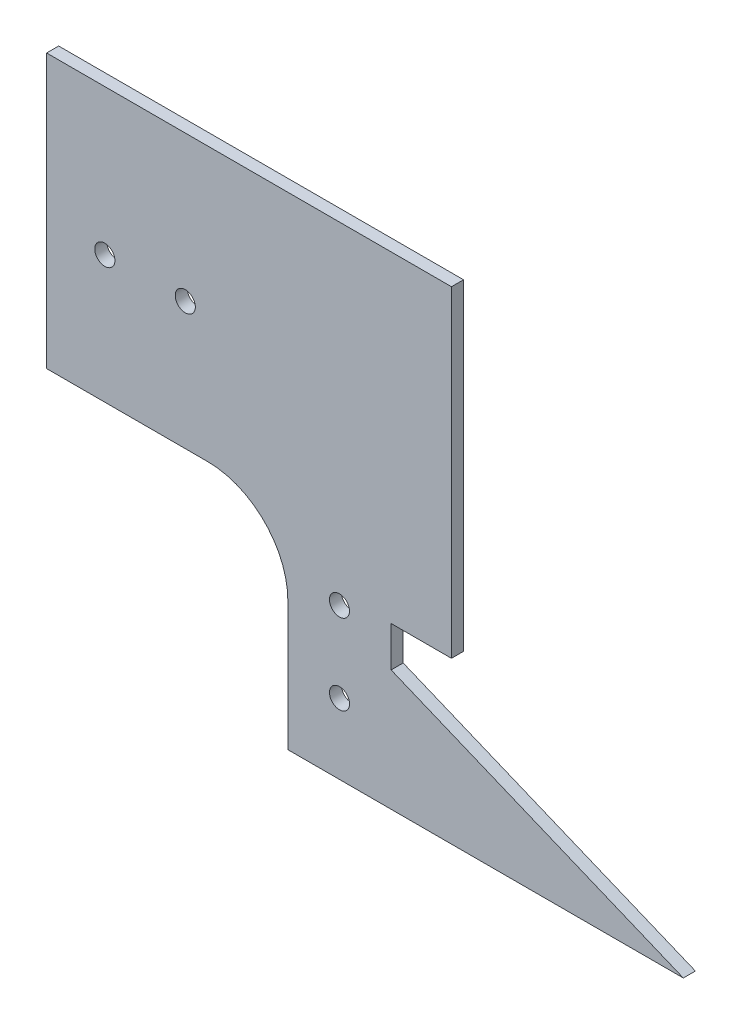
ISO-10303-21;
HEADER;
FILE_DESCRIPTION(('STEP AP214'),'2;1');
FILE_NAME('part.step','',(''),(''),'','','');
FILE_SCHEMA(('AUTOMOTIVE_DESIGN { 1 0 10303 214 1 1 1 1 }'));
ENDSEC;
DATA;
#1=APPLICATION_CONTEXT('core data for automotive mechanical design processes');
#2=APPLICATION_PROTOCOL_DEFINITION('international standard','automotive_design',2000,#1);
#3=PRODUCT_CONTEXT('',#1,'mechanical');
#4=PRODUCT('Part','Part','',(#3));
#5=PRODUCT_RELATED_PRODUCT_CATEGORY('part','',(#4));
#6=PRODUCT_DEFINITION_FORMATION('','',#4);
#7=PRODUCT_DEFINITION_CONTEXT('part definition',#1,'design');
#8=PRODUCT_DEFINITION('design','',#6,#7);
#9=PRODUCT_DEFINITION_SHAPE('','',#8);
#10=(LENGTH_UNIT() NAMED_UNIT(*) SI_UNIT(.MILLI.,.METRE.));
#11=(NAMED_UNIT(*) PLANE_ANGLE_UNIT() SI_UNIT($,.RADIAN.));
#12=(NAMED_UNIT(*) SI_UNIT($,.STERADIAN.) SOLID_ANGLE_UNIT());
#13=UNCERTAINTY_MEASURE_WITH_UNIT(LENGTH_MEASURE(1.E-05),#10,'distance_accuracy_value','');
#14=(GEOMETRIC_REPRESENTATION_CONTEXT(3) GLOBAL_UNCERTAINTY_ASSIGNED_CONTEXT((#13)) GLOBAL_UNIT_ASSIGNED_CONTEXT((#10,
#11,#12)) REPRESENTATION_CONTEXT('',''));
#15=CARTESIAN_POINT('',(0.,0.,0.));
#16=DIRECTION('',(0.,0.,1.));
#17=DIRECTION('',(1.,0.,0.));
#18=AXIS2_PLACEMENT_3D('',#15,#16,#17);
#19=CARTESIAN_POINT('',(40.0245996330395,32.076104431391,3.));
#20=DIRECTION('',(0.,0.,-1.));
#21=DIRECTION('',(-1.,0.,0.));
#22=AXIS2_PLACEMENT_3D('',#19,#20,#21);
#23=CYLINDRICAL_SURFACE('',#22,19.9754003669605);
#24=CARTESIAN_POINT('',(40.0245996330395,32.076104431391,0.));
#25=DIRECTION('',(0.,0.,1.));
#26=DIRECTION('',(1.,0.,0.));
#27=AXIS2_PLACEMENT_3D('',#24,#25,#26);
#28=CIRCLE('',#27,19.9754003669605);
#29=CARTESIAN_POINT('',(60.,32.076104431391,0.));
#30=VERTEX_POINT('',#29);
#31=CARTESIAN_POINT('',(40.0245996330395,52.0515047983515,0.));
#32=VERTEX_POINT('',#31);
#33=EDGE_CURVE('E170',#30,#32,#28,.T.);
#34=ORIENTED_EDGE('',*,*,#33,.F.);
#35=DIRECTION('',(0.,0.,-1.));
#36=VECTOR('',#35,1.);
#37=CARTESIAN_POINT('',(60.,32.076104431391,3.));
#38=LINE('',#37,#36);
#39=CARTESIAN_POINT('',(60.,32.076104431391,3.));
#40=VERTEX_POINT('',#39);
#41=EDGE_CURVE('E11',#40,#30,#38,.T.);
#42=ORIENTED_EDGE('',*,*,#41,.F.);
#43=CARTESIAN_POINT('',(40.0245996330395,32.076104431391,3.));
#44=DIRECTION('',(0.,0.,1.));
#45=DIRECTION('',(1.,0.,0.));
#46=AXIS2_PLACEMENT_3D('',#43,#44,#45);
#47=CIRCLE('',#46,19.9754003669605);
#48=CARTESIAN_POINT('',(40.0245996330395,52.0515047983515,3.));
#49=VERTEX_POINT('',#48);
#50=EDGE_CURVE('E421',#40,#49,#47,.T.);
#51=ORIENTED_EDGE('',*,*,#50,.T.);
#52=DIRECTION('',(0.,0.,-1.));
#53=VECTOR('',#52,1.);
#54=CARTESIAN_POINT('',(40.0245996330395,52.0515047983515,3.));
#55=LINE('',#54,#53);
#56=EDGE_CURVE('E56',#49,#32,#55,.T.);
#57=ORIENTED_EDGE('',*,*,#56,.T.);
#58=EDGE_LOOP('',(#34,#42,#51,#57));
#59=FACE_BOUND('',#58,.T.);
#60=ADVANCED_FACE('F39',(#59),#23,.F.);
#61=CARTESIAN_POINT('',(60.,0.,3.));
#62=DIRECTION('',(-1.,0.,0.));
#63=DIRECTION('',(0.,-1.,0.));
#64=AXIS2_PLACEMENT_3D('',#61,#62,#63);
#65=PLANE('',#64);
#66=DIRECTION('',(0.,1.,0.));
#67=VECTOR('',#66,1.);
#68=CARTESIAN_POINT('',(60.,0.,0.));
#69=LINE('',#68,#67);
#70=CARTESIAN_POINT('',(60.,0.,0.));
#71=VERTEX_POINT('',#70);
#72=EDGE_CURVE('E167',#71,#30,#69,.T.);
#73=ORIENTED_EDGE('',*,*,#72,.F.);
#74=DIRECTION('',(0.,0.,-1.));
#75=VECTOR('',#74,1.);
#76=CARTESIAN_POINT('',(60.,0.,3.));
#77=LINE('',#76,#75);
#78=CARTESIAN_POINT('',(60.,0.,3.));
#79=VERTEX_POINT('',#78);
#80=EDGE_CURVE('E48',#79,#71,#77,.T.);
#81=ORIENTED_EDGE('',*,*,#80,.F.);
#82=DIRECTION('',(0.,1.,0.));
#83=VECTOR('',#82,1.);
#84=CARTESIAN_POINT('',(60.,0.,3.));
#85=LINE('',#84,#83);
#86=EDGE_CURVE('E419',#79,#40,#85,.T.);
#87=ORIENTED_EDGE('',*,*,#86,.T.);
#88=ORIENTED_EDGE('',*,*,#41,.T.);
#89=EDGE_LOOP('',(#73,#81,#87,#88));
#90=FACE_BOUND('',#89,.T.);
#91=ADVANCED_FACE('F168',(#90),#65,.T.);
#92=CARTESIAN_POINT('',(0.,0.,3.));
#93=DIRECTION('',(0.,-1.,0.));
#94=DIRECTION('',(1.,0.,0.));
#95=AXIS2_PLACEMENT_3D('',#92,#93,#94);
#96=PLANE('',#95);
#97=DIRECTION('',(-1.,0.,0.));
#98=VECTOR('',#97,1.);
#99=CARTESIAN_POINT('',(0.,0.,0.));
#100=LINE('',#99,#98);
#101=CARTESIAN_POINT('',(158.303291844802,0.,0.));
#102=VERTEX_POINT('',#101);
#103=EDGE_CURVE('E159',#102,#71,#100,.T.);
#104=ORIENTED_EDGE('',*,*,#103,.F.);
#105=DIRECTION('',(0.,0.,-1.));
#106=VECTOR('',#105,1.);
#107=CARTESIAN_POINT('',(158.303291844802,0.,3.));
#108=LINE('',#107,#106);
#109=CARTESIAN_POINT('',(158.303291844802,0.,3.));
#110=VERTEX_POINT('',#109);
#111=EDGE_CURVE('E152',#110,#102,#108,.T.);
#112=ORIENTED_EDGE('',*,*,#111,.F.);
#113=DIRECTION('',(-1.,0.,0.));
#114=VECTOR('',#113,1.);
#115=CARTESIAN_POINT('',(0.,0.,3.));
#116=LINE('',#115,#114);
#117=EDGE_CURVE('E162',#110,#79,#116,.T.);
#118=ORIENTED_EDGE('',*,*,#117,.T.);
#119=ORIENTED_EDGE('',*,*,#80,.T.);
#120=EDGE_LOOP('',(#104,#112,#118,#119));
#121=FACE_BOUND('',#120,.T.);
#122=ADVANCED_FACE('F157',(#121),#96,.T.);
#123=CARTESIAN_POINT('',(23.0674954729512,55.8529419152529,3.));
#124=DIRECTION('',(0.381729083028025,0.92427425971439,0.));
#125=DIRECTION('',(-0.92427425971439,0.381729083028025,0.));
#126=AXIS2_PLACEMENT_3D('',#123,#124,#125);
#127=PLANE('',#126);
#128=DIRECTION('',(0.92427425971439,-0.381729083028025,0.));
#129=VECTOR('',#128,1.);
#130=CARTESIAN_POINT('',(23.0674954729512,55.8529419152529,0.));
#131=LINE('',#130,#129);
#132=CARTESIAN_POINT('',(85.6647923847122,30.,0.));
#133=VERTEX_POINT('',#132);
#134=EDGE_CURVE('E175',#133,#102,#131,.T.);
#135=ORIENTED_EDGE('',*,*,#134,.F.);
#136=DIRECTION('',(0.,0.,-1.));
#137=VECTOR('',#136,1.);
#138=CARTESIAN_POINT('',(85.6647923847122,30.,3.));
#139=LINE('',#138,#137);
#140=CARTESIAN_POINT('',(85.6647923847122,30.,3.));
#141=VERTEX_POINT('',#140);
#142=EDGE_CURVE('E150',#141,#133,#139,.T.);
#143=ORIENTED_EDGE('',*,*,#142,.F.);
#144=DIRECTION('',(0.92427425971439,-0.381729083028025,0.));
#145=VECTOR('',#144,1.);
#146=CARTESIAN_POINT('',(23.0674954729512,55.8529419152529,3.));
#147=LINE('',#146,#145);
#148=EDGE_CURVE('E412',#141,#110,#147,.T.);
#149=ORIENTED_EDGE('',*,*,#148,.T.);
#150=ORIENTED_EDGE('',*,*,#111,.T.);
#151=EDGE_LOOP('',(#135,#143,#149,#150));
#152=FACE_BOUND('',#151,.T.);
#153=ADVANCED_FACE('F342',(#152),#127,.T.);
#154=CARTESIAN_POINT('',(85.6647923847122,0.,3.));
#155=DIRECTION('',(1.,0.,0.));
#156=DIRECTION('',(0.,0.,-1.));
#157=AXIS2_PLACEMENT_3D('',#154,#155,#156);
#158=PLANE('',#157);
#159=DIRECTION('',(0.,-1.,0.));
#160=VECTOR('',#159,1.);
#161=CARTESIAN_POINT('',(85.6647923847122,0.,0.));
#162=LINE('',#161,#160);
#163=CARTESIAN_POINT('',(85.6647923847122,40.,0.));
#164=VERTEX_POINT('',#163);
#165=EDGE_CURVE('E177',#164,#133,#162,.T.);
#166=ORIENTED_EDGE('',*,*,#165,.F.);
#167=DIRECTION('',(0.,0.,-1.));
#168=VECTOR('',#167,1.);
#169=CARTESIAN_POINT('',(85.6647923847122,40.,3.));
#170=LINE('',#169,#168);
#171=CARTESIAN_POINT('',(85.6647923847122,40.,3.));
#172=VERTEX_POINT('',#171);
#173=EDGE_CURVE('E148',#172,#164,#170,.T.);
#174=ORIENTED_EDGE('',*,*,#173,.F.);
#175=DIRECTION('',(0.,-1.,0.));
#176=VECTOR('',#175,1.);
#177=CARTESIAN_POINT('',(85.6647923847122,0.,3.));
#178=LINE('',#177,#176);
#179=EDGE_CURVE('E410',#172,#141,#178,.T.);
#180=ORIENTED_EDGE('',*,*,#179,.T.);
#181=ORIENTED_EDGE('',*,*,#142,.T.);
#182=EDGE_LOOP('',(#166,#174,#180,#181));
#183=FACE_BOUND('',#182,.T.);
#184=ADVANCED_FACE('F331',(#183),#158,.T.);
#185=CARTESIAN_POINT('',(0.,40.,3.));
#186=DIRECTION('',(0.,1.,0.));
#187=DIRECTION('',(0.,0.,1.));
#188=AXIS2_PLACEMENT_3D('',#185,#186,#187);
#189=PLANE('',#188);
#190=DIRECTION('',(1.,0.,0.));
#191=VECTOR('',#190,1.);
#192=CARTESIAN_POINT('',(0.,40.,0.));
#193=LINE('',#192,#191);
#194=CARTESIAN_POINT('',(100.664792384712,40.,0.));
#195=VERTEX_POINT('',#194);
#196=EDGE_CURVE('E182',#164,#195,#193,.T.);
#197=ORIENTED_EDGE('',*,*,#196,.T.);
#198=DIRECTION('',(0.,0.,-1.));
#199=VECTOR('',#198,1.);
#200=CARTESIAN_POINT('',(100.664792384712,40.,3.));
#201=LINE('',#200,#199);
#202=CARTESIAN_POINT('',(100.664792384712,40.,3.));
#203=VERTEX_POINT('',#202);
#204=EDGE_CURVE('E141',#203,#195,#201,.T.);
#205=ORIENTED_EDGE('',*,*,#204,.F.);
#206=DIRECTION('',(1.,0.,0.));
#207=VECTOR('',#206,1.);
#208=CARTESIAN_POINT('',(0.,40.,3.));
#209=LINE('',#208,#207);
#210=EDGE_CURVE('E411',#172,#203,#209,.T.);
#211=ORIENTED_EDGE('',*,*,#210,.F.);
#212=ORIENTED_EDGE('',*,*,#173,.T.);
#213=EDGE_LOOP('',(#197,#205,#211,#212));
#214=FACE_BOUND('',#213,.T.);
#215=ADVANCED_FACE('F320',(#214),#189,.F.);
#216=CARTESIAN_POINT('',(100.664792384712,0.,3.));
#217=DIRECTION('',(-1.,0.,0.));
#218=DIRECTION('',(0.,0.,1.));
#219=AXIS2_PLACEMENT_3D('',#216,#217,#218);
#220=PLANE('',#219);
#221=DIRECTION('',(0.,1.,0.));
#222=VECTOR('',#221,1.);
#223=CARTESIAN_POINT('',(100.664792384712,0.,0.));
#224=LINE('',#223,#222);
#225=CARTESIAN_POINT('',(100.664792384712,120.,0.));
#226=VERTEX_POINT('',#225);
#227=EDGE_CURVE('E185',#195,#226,#224,.T.);
#228=ORIENTED_EDGE('',*,*,#227,.T.);
#229=DIRECTION('',(0.,0.,-1.));
#230=VECTOR('',#229,1.);
#231=CARTESIAN_POINT('',(100.664792384712,120.,3.));
#232=LINE('',#231,#230);
#233=CARTESIAN_POINT('',(100.664792384712,120.,3.));
#234=VERTEX_POINT('',#233);
#235=EDGE_CURVE('E139',#234,#226,#232,.T.);
#236=ORIENTED_EDGE('',*,*,#235,.F.);
#237=DIRECTION('',(0.,1.,0.));
#238=VECTOR('',#237,1.);
#239=CARTESIAN_POINT('',(100.664792384712,0.,3.));
#240=LINE('',#239,#238);
#241=EDGE_CURVE('E132',#203,#234,#240,.T.);
#242=ORIENTED_EDGE('',*,*,#241,.F.);
#243=ORIENTED_EDGE('',*,*,#204,.T.);
#244=EDGE_LOOP('',(#228,#236,#242,#243));
#245=FACE_BOUND('',#244,.T.);
#246=ADVANCED_FACE('F310',(#245),#220,.F.);
#247=CARTESIAN_POINT('',(0.,120.,3.));
#248=DIRECTION('',(0.,-1.,0.));
#249=DIRECTION('',(0.,0.,-1.));
#250=AXIS2_PLACEMENT_3D('',#247,#248,#249);
#251=PLANE('',#250);
#252=DIRECTION('',(-1.,0.,0.));
#253=VECTOR('',#252,1.);
#254=CARTESIAN_POINT('',(0.,120.,0.));
#255=LINE('',#254,#253);
#256=CARTESIAN_POINT('',(0.0245996330394682,120.,0.));
#257=VERTEX_POINT('',#256);
#258=EDGE_CURVE('E138',#226,#257,#255,.T.);
#259=ORIENTED_EDGE('',*,*,#258,.T.);
#260=DIRECTION('',(0.,0.,-1.));
#261=VECTOR('',#260,1.);
#262=CARTESIAN_POINT('',(0.0245996330394682,120.,3.));
#263=LINE('',#262,#261);
#264=CARTESIAN_POINT('',(0.0245996330394682,120.,3.));
#265=VERTEX_POINT('',#264);
#266=EDGE_CURVE('E122',#265,#257,#263,.T.);
#267=ORIENTED_EDGE('',*,*,#266,.F.);
#268=DIRECTION('',(-1.,0.,0.));
#269=VECTOR('',#268,1.);
#270=CARTESIAN_POINT('',(0.,120.,3.));
#271=LINE('',#270,#269);
#272=EDGE_CURVE('E127',#234,#265,#271,.T.);
#273=ORIENTED_EDGE('',*,*,#272,.F.);
#274=ORIENTED_EDGE('',*,*,#235,.T.);
#275=EDGE_LOOP('',(#259,#267,#273,#274));
#276=FACE_BOUND('',#275,.T.);
#277=ADVANCED_FACE('F137',(#276),#251,.F.);
#278=CARTESIAN_POINT('',(0.0245996330394883,0.,3.));
#279=DIRECTION('',(1.,0.,0.));
#280=DIRECTION('',(0.,1.,0.));
#281=AXIS2_PLACEMENT_3D('',#278,#279,#280);
#282=PLANE('',#281);
#283=DIRECTION('',(0.,-1.,0.));
#284=VECTOR('',#283,1.);
#285=CARTESIAN_POINT('',(0.0245996330394883,0.,0.));
#286=LINE('',#285,#284);
#287=CARTESIAN_POINT('',(0.0245996330394796,52.0515047983515,0.));
#288=VERTEX_POINT('',#287);
#289=EDGE_CURVE('E189',#257,#288,#286,.T.);
#290=ORIENTED_EDGE('',*,*,#289,.T.);
#291=DIRECTION('',(0.,0.,-1.));
#292=VECTOR('',#291,1.);
#293=CARTESIAN_POINT('',(0.0245996330394796,52.0515047983515,3.));
#294=LINE('',#293,#292);
#295=CARTESIAN_POINT('',(0.0245996330394796,52.0515047983515,3.));
#296=VERTEX_POINT('',#295);
#297=EDGE_CURVE('E88',#296,#288,#294,.T.);
#298=ORIENTED_EDGE('',*,*,#297,.F.);
#299=DIRECTION('',(0.,-1.,0.));
#300=VECTOR('',#299,1.);
#301=CARTESIAN_POINT('',(0.0245996330394883,0.,3.));
#302=LINE('',#301,#300);
#303=EDGE_CURVE('E118',#265,#296,#302,.T.);
#304=ORIENTED_EDGE('',*,*,#303,.F.);
#305=ORIENTED_EDGE('',*,*,#266,.T.);
#306=EDGE_LOOP('',(#290,#298,#304,#305));
#307=FACE_BOUND('',#306,.T.);
#308=ADVANCED_FACE('F120',(#307),#282,.F.);
#309=CARTESIAN_POINT('',(72.8323961923561,37.4818363128672,3.));
#310=DIRECTION('',(0.,0.,-1.));
#311=DIRECTION('',(-1.,0.,0.));
#312=AXIS2_PLACEMENT_3D('',#309,#310,#311);
#313=CYLINDRICAL_SURFACE('',#312,2.49629558507454);
#314=CARTESIAN_POINT('',(72.8323961923561,37.4818363128672,3.));
#315=DIRECTION('',(0.,0.,1.));
#316=DIRECTION('',(1.,0.,0.));
#317=AXIS2_PLACEMENT_3D('',#314,#315,#316);
#318=CIRCLE('',#317,2.49629558507454);
#319=CARTESIAN_POINT('',(75.3286917774306,37.4818363128672,3.));
#320=VERTEX_POINT('',#319);
#321=EDGE_CURVE('E423',#320,#320,#318,.T.);
#322=ORIENTED_EDGE('',*,*,#321,.T.);
#323=EDGE_LOOP('',(#322));
#324=FACE_BOUND('',#323,.T.);
#325=CARTESIAN_POINT('',(72.8323961923561,37.4818363128672,0.));
#326=DIRECTION('',(0.,0.,1.));
#327=DIRECTION('',(1.,0.,0.));
#328=AXIS2_PLACEMENT_3D('',#325,#326,#327);
#329=CIRCLE('',#328,2.49629558507454);
#330=CARTESIAN_POINT('',(75.3286917774306,37.4818363128672,0.));
#331=VERTEX_POINT('',#330);
#332=EDGE_CURVE('E205',#331,#331,#329,.T.);
#333=ORIENTED_EDGE('',*,*,#332,.F.);
#334=EDGE_LOOP('',(#333));
#335=FACE_BOUND('',#334,.T.);
#336=ADVANCED_FACE('F228',(#324,#335),#313,.F.);
#337=CARTESIAN_POINT('',(72.8384608717,17.5,3.));
#338=DIRECTION('',(0.,0.,-1.));
#339=DIRECTION('',(-1.,0.,0.));
#340=AXIS2_PLACEMENT_3D('',#337,#338,#339);
#341=CYLINDRICAL_SURFACE('',#340,2.49999999999999);
#342=CARTESIAN_POINT('',(72.8384608717,17.5,3.));
#343=DIRECTION('',(0.,0.,1.));
#344=DIRECTION('',(1.,0.,0.));
#345=AXIS2_PLACEMENT_3D('',#342,#343,#344);
#346=CIRCLE('',#345,2.49999999999999);
#347=CARTESIAN_POINT('',(75.3384608717,17.5,3.));
#348=VERTEX_POINT('',#347);
#349=EDGE_CURVE('E426',#348,#348,#346,.T.);
#350=ORIENTED_EDGE('',*,*,#349,.T.);
#351=EDGE_LOOP('',(#350));
#352=FACE_BOUND('',#351,.T.);
#353=CARTESIAN_POINT('',(72.8384608717,17.5,0.));
#354=DIRECTION('',(0.,0.,1.));
#355=DIRECTION('',(1.,0.,0.));
#356=AXIS2_PLACEMENT_3D('',#353,#354,#355);
#357=CIRCLE('',#356,2.49999999999999);
#358=CARTESIAN_POINT('',(75.3384608717,17.5,0.));
#359=VERTEX_POINT('',#358);
#360=EDGE_CURVE('E202',#359,#359,#357,.T.);
#361=ORIENTED_EDGE('',*,*,#360,.F.);
#362=EDGE_LOOP('',(#361));
#363=FACE_BOUND('',#362,.T.);
#364=ADVANCED_FACE('F231',(#352,#363),#341,.F.);
#365=CARTESIAN_POINT('',(14.5,83.79,3.));
#366=DIRECTION('',(0.,0.,-1.));
#367=DIRECTION('',(-1.,0.,0.));
#368=AXIS2_PLACEMENT_3D('',#365,#366,#367);
#369=CYLINDRICAL_SURFACE('',#368,2.5);
#370=CARTESIAN_POINT('',(14.5,83.79,3.));
#371=DIRECTION('',(0.,0.,1.));
#372=DIRECTION('',(1.,0.,0.));
#373=AXIS2_PLACEMENT_3D('',#370,#371,#372);
#374=CIRCLE('',#373,2.5);
#375=CARTESIAN_POINT('',(17.,83.79,3.));
#376=VERTEX_POINT('',#375);
#377=EDGE_CURVE('E242',#376,#376,#374,.T.);
#378=ORIENTED_EDGE('',*,*,#377,.T.);
#379=EDGE_LOOP('',(#378));
#380=FACE_BOUND('',#379,.T.);
#381=CARTESIAN_POINT('',(14.5,83.79,0.));
#382=DIRECTION('',(0.,0.,1.));
#383=DIRECTION('',(1.,0.,0.));
#384=AXIS2_PLACEMENT_3D('',#381,#382,#383);
#385=CIRCLE('',#384,2.5);
#386=CARTESIAN_POINT('',(17.,83.79,0.));
#387=VERTEX_POINT('',#386);
#388=EDGE_CURVE('E199',#387,#387,#385,.T.);
#389=ORIENTED_EDGE('',*,*,#388,.F.);
#390=EDGE_LOOP('',(#389));
#391=FACE_BOUND('',#390,.T.);
#392=ADVANCED_FACE('F216',(#380,#391),#369,.F.);
#393=CARTESIAN_POINT('',(34.5,83.79,3.));
#394=DIRECTION('',(0.,0.,-1.));
#395=DIRECTION('',(-1.,0.,0.));
#396=AXIS2_PLACEMENT_3D('',#393,#394,#395);
#397=CYLINDRICAL_SURFACE('',#396,2.5);
#398=CARTESIAN_POINT('',(34.5,83.79,3.));
#399=DIRECTION('',(0.,0.,1.));
#400=DIRECTION('',(1.,0.,0.));
#401=AXIS2_PLACEMENT_3D('',#398,#399,#400);
#402=CIRCLE('',#401,2.5);
#403=CARTESIAN_POINT('',(37.,83.79,3.));
#404=VERTEX_POINT('',#403);
#405=EDGE_CURVE('E193',#404,#404,#402,.T.);
#406=ORIENTED_EDGE('',*,*,#405,.T.);
#407=EDGE_LOOP('',(#406));
#408=FACE_BOUND('',#407,.T.);
#409=CARTESIAN_POINT('',(34.5,83.79,0.));
#410=DIRECTION('',(0.,0.,1.));
#411=DIRECTION('',(1.,0.,0.));
#412=AXIS2_PLACEMENT_3D('',#409,#410,#411);
#413=CIRCLE('',#412,2.5);
#414=CARTESIAN_POINT('',(37.,83.79,0.));
#415=VERTEX_POINT('',#414);
#416=EDGE_CURVE('E196',#415,#415,#413,.T.);
#417=ORIENTED_EDGE('',*,*,#416,.F.);
#418=EDGE_LOOP('',(#417));
#419=FACE_BOUND('',#418,.T.);
#420=ADVANCED_FACE('F41',(#408,#419),#397,.F.);
#421=CARTESIAN_POINT('',(0.,52.0515047983515,3.));
#422=DIRECTION('',(0.,-1.,0.));
#423=DIRECTION('',(1.,0.,0.));
#424=AXIS2_PLACEMENT_3D('',#421,#422,#423);
#425=PLANE('',#424);
#426=DIRECTION('',(-1.,0.,0.));
#427=VECTOR('',#426,1.);
#428=CARTESIAN_POINT('',(0.,52.0515047983515,0.));
#429=LINE('',#428,#427);
#430=EDGE_CURVE('E191',#32,#288,#429,.T.);
#431=ORIENTED_EDGE('',*,*,#430,.F.);
#432=ORIENTED_EDGE('',*,*,#56,.F.);
#433=DIRECTION('',(-1.,0.,0.));
#434=VECTOR('',#433,1.);
#435=CARTESIAN_POINT('',(0.,52.0515047983515,3.));
#436=LINE('',#435,#434);
#437=EDGE_CURVE('E126',#49,#296,#436,.T.);
#438=ORIENTED_EDGE('',*,*,#437,.T.);
#439=ORIENTED_EDGE('',*,*,#297,.T.);
#440=EDGE_LOOP('',(#431,#432,#438,#439));
#441=FACE_BOUND('',#440,.T.);
#442=ADVANCED_FACE('F207',(#441),#425,.T.);
#443=CARTESIAN_POINT('',(0.,0.,3.));
#444=DIRECTION('',(0.,0.,1.));
#445=DIRECTION('',(1.,0.,0.));
#446=AXIS2_PLACEMENT_3D('',#443,#444,#445);
#447=PLANE('',#446);
#448=ORIENTED_EDGE('',*,*,#405,.F.);
#449=EDGE_LOOP('',(#448));
#450=FACE_BOUND('',#449,.T.);
#451=ORIENTED_EDGE('',*,*,#377,.F.);
#452=EDGE_LOOP('',(#451));
#453=FACE_BOUND('',#452,.T.);
#454=ORIENTED_EDGE('',*,*,#349,.F.);
#455=EDGE_LOOP('',(#454));
#456=FACE_BOUND('',#455,.T.);
#457=ORIENTED_EDGE('',*,*,#321,.F.);
#458=EDGE_LOOP('',(#457));
#459=FACE_BOUND('',#458,.T.);
#460=ORIENTED_EDGE('',*,*,#50,.F.);
#461=ORIENTED_EDGE('',*,*,#86,.F.);
#462=ORIENTED_EDGE('',*,*,#117,.F.);
#463=ORIENTED_EDGE('',*,*,#148,.F.);
#464=ORIENTED_EDGE('',*,*,#179,.F.);
#465=ORIENTED_EDGE('',*,*,#210,.T.);
#466=ORIENTED_EDGE('',*,*,#241,.T.);
#467=ORIENTED_EDGE('',*,*,#272,.T.);
#468=ORIENTED_EDGE('',*,*,#303,.T.);
#469=ORIENTED_EDGE('',*,*,#437,.F.);
#470=EDGE_LOOP('',(#460,#461,#462,#463,#464,#465,#466,#467,#468,#469));
#471=FACE_BOUND('',#470,.T.);
#472=ADVANCED_FACE('F130',(#450,#453,#456,#459,#471),#447,.T.);
#473=CARTESIAN_POINT('',(0.,0.,0.));
#474=DIRECTION('',(0.,0.,1.));
#475=DIRECTION('',(1.,0.,0.));
#476=AXIS2_PLACEMENT_3D('',#473,#474,#475);
#477=PLANE('',#476);
#478=ORIENTED_EDGE('',*,*,#416,.T.);
#479=EDGE_LOOP('',(#478));
#480=FACE_BOUND('',#479,.T.);
#481=ORIENTED_EDGE('',*,*,#388,.T.);
#482=EDGE_LOOP('',(#481));
#483=FACE_BOUND('',#482,.T.);
#484=ORIENTED_EDGE('',*,*,#360,.T.);
#485=EDGE_LOOP('',(#484));
#486=FACE_BOUND('',#485,.T.);
#487=ORIENTED_EDGE('',*,*,#332,.T.);
#488=EDGE_LOOP('',(#487));
#489=FACE_BOUND('',#488,.T.);
#490=ORIENTED_EDGE('',*,*,#33,.T.);
#491=ORIENTED_EDGE('',*,*,#430,.T.);
#492=ORIENTED_EDGE('',*,*,#289,.F.);
#493=ORIENTED_EDGE('',*,*,#258,.F.);
#494=ORIENTED_EDGE('',*,*,#227,.F.);
#495=ORIENTED_EDGE('',*,*,#196,.F.);
#496=ORIENTED_EDGE('',*,*,#165,.T.);
#497=ORIENTED_EDGE('',*,*,#134,.T.);
#498=ORIENTED_EDGE('',*,*,#103,.T.);
#499=ORIENTED_EDGE('',*,*,#72,.T.);
#500=EDGE_LOOP('',(#490,#491,#492,#493,#494,#495,#496,#497,#498,#499));
#501=FACE_BOUND('',#500,.T.);
#502=ADVANCED_FACE('F172',(#480,#483,#486,#489,#501),#477,.F.);
#503=CLOSED_SHELL('',(#60,#91,#122,#153,#184,#215,#246,#277,#308,#336,#364,#392,#420,#442,#472,#502));
#504=MANIFOLD_SOLID_BREP('B2',#503);
#505=ADVANCED_BREP_SHAPE_REPRESENTATION('',(#18,#504),#14);
#506=SHAPE_DEFINITION_REPRESENTATION(#9,#505);
ENDSEC;
END-ISO-10303-21;
